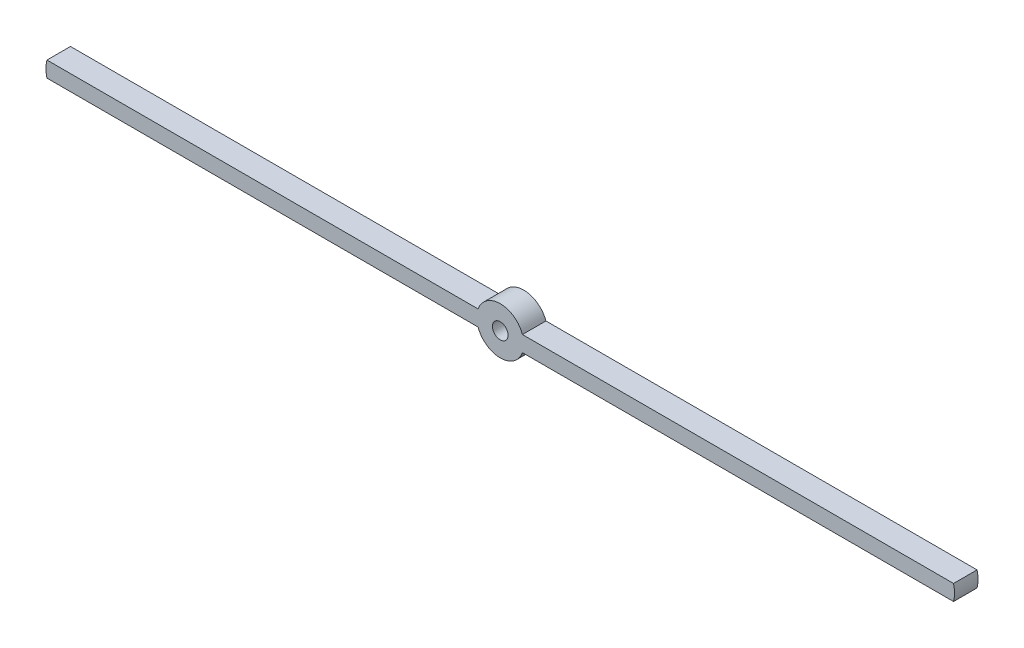
ISO-10303-21;
HEADER;
FILE_DESCRIPTION(('STEP AP214'),'2;1');
FILE_NAME('part.step','',(''),(''),'','','');
FILE_SCHEMA(('AUTOMOTIVE_DESIGN { 1 0 10303 214 1 1 1 1 }'));
ENDSEC;
DATA;
#1=APPLICATION_CONTEXT('core data for automotive mechanical design processes');
#2=APPLICATION_PROTOCOL_DEFINITION('international standard','automotive_design',2000,#1);
#3=PRODUCT_CONTEXT('',#1,'mechanical');
#4=PRODUCT('Part','Part','',(#3));
#5=PRODUCT_RELATED_PRODUCT_CATEGORY('part','',(#4));
#6=PRODUCT_DEFINITION_FORMATION('','',#4);
#7=PRODUCT_DEFINITION_CONTEXT('part definition',#1,'design');
#8=PRODUCT_DEFINITION('design','',#6,#7);
#9=PRODUCT_DEFINITION_SHAPE('','',#8);
#10=(LENGTH_UNIT() NAMED_UNIT(*) SI_UNIT(.MILLI.,.METRE.));
#11=(NAMED_UNIT(*) PLANE_ANGLE_UNIT() SI_UNIT($,.RADIAN.));
#12=(NAMED_UNIT(*) SI_UNIT($,.STERADIAN.) SOLID_ANGLE_UNIT());
#13=UNCERTAINTY_MEASURE_WITH_UNIT(LENGTH_MEASURE(1.E-05),#10,'distance_accuracy_value','');
#14=(GEOMETRIC_REPRESENTATION_CONTEXT(3) GLOBAL_UNCERTAINTY_ASSIGNED_CONTEXT((#13)) GLOBAL_UNIT_ASSIGNED_CONTEXT((#10,
#11,#12)) REPRESENTATION_CONTEXT('',''));
#15=CARTESIAN_POINT('',(0.,0.,0.));
#16=DIRECTION('',(0.,0.,1.));
#17=DIRECTION('',(1.,0.,0.));
#18=AXIS2_PLACEMENT_3D('',#15,#16,#17);
#19=CARTESIAN_POINT('',(0.,0.,6.));
#20=DIRECTION('',(0.,0.,-1.));
#21=DIRECTION('',(-1.,0.,0.));
#22=AXIS2_PLACEMENT_3D('',#19,#20,#21);
#23=PLANE('',#22);
#24=CARTESIAN_POINT('',(0.,0.,6.));
#25=DIRECTION('',(0.,0.,-1.));
#26=DIRECTION('',(-1.,0.,0.));
#27=AXIS2_PLACEMENT_3D('',#24,#25,#26);
#28=CIRCLE('',#27,6.);
#29=CARTESIAN_POINT('',(5.65685424949238,-2.,6.));
#30=VERTEX_POINT('',#29);
#31=CARTESIAN_POINT('',(-5.65685424949238,-2.,6.));
#32=VERTEX_POINT('',#31);
#33=EDGE_CURVE('E199',#30,#32,#28,.T.);
#34=ORIENTED_EDGE('',*,*,#33,.F.);
#35=DIRECTION('',(1.,0.,0.));
#36=VECTOR('',#35,1.);
#37=CARTESIAN_POINT('',(5.65685424949238,-2.,6.));
#38=LINE('',#37,#36);
#39=CARTESIAN_POINT('',(115.656854249492,-2.,6.));
#40=VERTEX_POINT('',#39);
#41=EDGE_CURVE('E157',#30,#40,#38,.T.);
#42=ORIENTED_EDGE('',*,*,#41,.T.);
#43=CARTESIAN_POINT('',(107.910887557078,0.,6.));
#44=DIRECTION('',(0.,0.,-1.));
#45=DIRECTION('',(-1.,0.,0.));
#46=AXIS2_PLACEMENT_3D('',#43,#44,#45);
#47=CIRCLE('',#46,8.00000000000001);
#48=CARTESIAN_POINT('',(115.656854249492,2.,6.));
#49=VERTEX_POINT('',#48);
#50=EDGE_CURVE('E140',#49,#40,#47,.T.);
#51=ORIENTED_EDGE('',*,*,#50,.F.);
#52=DIRECTION('',(1.,0.,0.));
#53=VECTOR('',#52,1.);
#54=CARTESIAN_POINT('',(5.65685424949238,2.,6.));
#55=LINE('',#54,#53);
#56=CARTESIAN_POINT('',(5.65685424949238,2.,6.));
#57=VERTEX_POINT('',#56);
#58=EDGE_CURVE('E155',#57,#49,#55,.T.);
#59=ORIENTED_EDGE('',*,*,#58,.F.);
#60=CARTESIAN_POINT('',(0.,-1.27068494615301E-13,6.));
#61=DIRECTION('',(0.,0.,-1.));
#62=DIRECTION('',(-1.,0.,0.));
#63=AXIS2_PLACEMENT_3D('',#60,#61,#62);
#64=CIRCLE('',#63,6.00000000000004);
#65=CARTESIAN_POINT('',(-5.65685424949238,2.,6.));
#66=VERTEX_POINT('',#65);
#67=EDGE_CURVE('E162',#66,#57,#64,.T.);
#68=ORIENTED_EDGE('',*,*,#67,.F.);
#69=DIRECTION('',(-1.,0.,0.));
#70=VECTOR('',#69,1.);
#71=CARTESIAN_POINT('',(-5.65685424949238,2.,6.));
#72=LINE('',#71,#70);
#73=CARTESIAN_POINT('',(-115.656854249492,2.00000000000002,6.));
#74=VERTEX_POINT('',#73);
#75=EDGE_CURVE('E166',#66,#74,#72,.T.);
#76=ORIENTED_EDGE('',*,*,#75,.T.);
#77=CARTESIAN_POINT('',(-107.910887557078,0.,6.));
#78=DIRECTION('',(0.,0.,1.));
#79=DIRECTION('',(1.,0.,0.));
#80=AXIS2_PLACEMENT_3D('',#77,#78,#79);
#81=CIRCLE('',#80,8.);
#82=CARTESIAN_POINT('',(-115.656854249492,-2.00000000000001,6.));
#83=VERTEX_POINT('',#82);
#84=EDGE_CURVE('E228',#74,#83,#81,.T.);
#85=ORIENTED_EDGE('',*,*,#84,.T.);
#86=DIRECTION('',(-1.,0.,0.));
#87=VECTOR('',#86,1.);
#88=CARTESIAN_POINT('',(-5.65685424949238,-2.,6.));
#89=LINE('',#88,#87);
#90=EDGE_CURVE('E223',#32,#83,#89,.T.);
#91=ORIENTED_EDGE('',*,*,#90,.F.);
#92=EDGE_LOOP('',(#34,#42,#51,#59,#68,#76,#85,#91));
#93=FACE_BOUND('',#92,.T.);
#94=CARTESIAN_POINT('',(0.,0.,6.));
#95=DIRECTION('',(0.,0.,1.));
#96=DIRECTION('',(1.,0.,0.));
#97=AXIS2_PLACEMENT_3D('',#94,#95,#96);
#98=CIRCLE('',#97,2.);
#99=CARTESIAN_POINT('',(2.,0.,6.));
#100=VERTEX_POINT('',#99);
#101=EDGE_CURVE('E177',#100,#100,#98,.T.);
#102=ORIENTED_EDGE('',*,*,#101,.F.);
#103=EDGE_LOOP('',(#102));
#104=FACE_BOUND('',#103,.T.);
#105=ADVANCED_FACE('F66',(#93,#104),#23,.F.);
#106=CARTESIAN_POINT('',(0.,0.,0.));
#107=DIRECTION('',(0.,0.,-1.));
#108=DIRECTION('',(-1.,0.,0.));
#109=AXIS2_PLACEMENT_3D('',#106,#107,#108);
#110=PLANE('',#109);
#111=CARTESIAN_POINT('',(0.,0.,0.));
#112=DIRECTION('',(0.,0.,-1.));
#113=DIRECTION('',(-1.,0.,0.));
#114=AXIS2_PLACEMENT_3D('',#111,#112,#113);
#115=CIRCLE('',#114,6.);
#116=CARTESIAN_POINT('',(5.65685424949238,-2.,0.));
#117=VERTEX_POINT('',#116);
#118=CARTESIAN_POINT('',(-5.65685424949238,-2.,0.));
#119=VERTEX_POINT('',#118);
#120=EDGE_CURVE('E172',#117,#119,#115,.T.);
#121=ORIENTED_EDGE('',*,*,#120,.T.);
#122=DIRECTION('',(-1.,0.,0.));
#123=VECTOR('',#122,1.);
#124=CARTESIAN_POINT('',(-5.65685424949238,-2.,0.));
#125=LINE('',#124,#123);
#126=CARTESIAN_POINT('',(-115.656854249492,-2.00000000000001,0.));
#127=VERTEX_POINT('',#126);
#128=EDGE_CURVE('E176',#119,#127,#125,.T.);
#129=ORIENTED_EDGE('',*,*,#128,.T.);
#130=CARTESIAN_POINT('',(-107.910887557078,0.,0.));
#131=DIRECTION('',(0.,0.,1.));
#132=DIRECTION('',(1.,0.,0.));
#133=AXIS2_PLACEMENT_3D('',#130,#131,#132);
#134=CIRCLE('',#133,8.);
#135=CARTESIAN_POINT('',(-115.656854249492,2.00000000000002,0.));
#136=VERTEX_POINT('',#135);
#137=EDGE_CURVE('E181',#136,#127,#134,.T.);
#138=ORIENTED_EDGE('',*,*,#137,.F.);
#139=DIRECTION('',(-1.,0.,0.));
#140=VECTOR('',#139,1.);
#141=CARTESIAN_POINT('',(-5.65685424949238,2.,0.));
#142=LINE('',#141,#140);
#143=CARTESIAN_POINT('',(-5.65685424949238,2.,0.));
#144=VERTEX_POINT('',#143);
#145=EDGE_CURVE('E185',#144,#136,#142,.T.);
#146=ORIENTED_EDGE('',*,*,#145,.F.);
#147=CARTESIAN_POINT('',(0.,-1.27068494615301E-13,0.));
#148=DIRECTION('',(0.,0.,-1.));
#149=DIRECTION('',(-1.,0.,0.));
#150=AXIS2_PLACEMENT_3D('',#147,#148,#149);
#151=CIRCLE('',#150,6.00000000000004);
#152=CARTESIAN_POINT('',(5.65685424949238,2.,0.));
#153=VERTEX_POINT('',#152);
#154=EDGE_CURVE('E188',#144,#153,#151,.T.);
#155=ORIENTED_EDGE('',*,*,#154,.T.);
#156=DIRECTION('',(1.,0.,0.));
#157=VECTOR('',#156,1.);
#158=CARTESIAN_POINT('',(5.65685424949238,2.,0.));
#159=LINE('',#158,#157);
#160=CARTESIAN_POINT('',(115.656854249492,2.,0.));
#161=VERTEX_POINT('',#160);
#162=EDGE_CURVE('E192',#153,#161,#159,.T.);
#163=ORIENTED_EDGE('',*,*,#162,.T.);
#164=CARTESIAN_POINT('',(107.910887557078,0.,0.));
#165=DIRECTION('',(0.,0.,-1.));
#166=DIRECTION('',(-1.,0.,0.));
#167=AXIS2_PLACEMENT_3D('',#164,#165,#166);
#168=CIRCLE('',#167,8.00000000000001);
#169=CARTESIAN_POINT('',(115.656854249492,-2.,0.));
#170=VERTEX_POINT('',#169);
#171=EDGE_CURVE('E142',#161,#170,#168,.T.);
#172=ORIENTED_EDGE('',*,*,#171,.T.);
#173=DIRECTION('',(1.,0.,0.));
#174=VECTOR('',#173,1.);
#175=CARTESIAN_POINT('',(5.65685424949238,-2.,0.));
#176=LINE('',#175,#174);
#177=EDGE_CURVE('E197',#117,#170,#176,.T.);
#178=ORIENTED_EDGE('',*,*,#177,.F.);
#179=EDGE_LOOP('',(#121,#129,#138,#146,#155,#163,#172,#178));
#180=FACE_BOUND('',#179,.T.);
#181=CARTESIAN_POINT('',(0.,0.,0.));
#182=DIRECTION('',(0.,0.,1.));
#183=DIRECTION('',(1.,0.,0.));
#184=AXIS2_PLACEMENT_3D('',#181,#182,#183);
#185=CIRCLE('',#184,2.);
#186=CARTESIAN_POINT('',(2.,0.,0.));
#187=VERTEX_POINT('',#186);
#188=EDGE_CURVE('E231',#187,#187,#185,.T.);
#189=ORIENTED_EDGE('',*,*,#188,.T.);
#190=EDGE_LOOP('',(#189));
#191=FACE_BOUND('',#190,.T.);
#192=ADVANCED_FACE('F220',(#180,#191),#110,.T.);
#193=CARTESIAN_POINT('',(0.,0.,6.));
#194=DIRECTION('',(0.,0.,-1.));
#195=DIRECTION('',(-1.,0.,0.));
#196=AXIS2_PLACEMENT_3D('',#193,#194,#195);
#197=CYLINDRICAL_SURFACE('',#196,6.);
#198=ORIENTED_EDGE('',*,*,#120,.F.);
#199=DIRECTION('',(0.,0.,-1.));
#200=VECTOR('',#199,1.);
#201=CARTESIAN_POINT('',(5.65685424949238,-2.,6.));
#202=LINE('',#201,#200);
#203=EDGE_CURVE('E12',#30,#117,#202,.T.);
#204=ORIENTED_EDGE('',*,*,#203,.F.);
#205=ORIENTED_EDGE('',*,*,#33,.T.);
#206=DIRECTION('',(0.,0.,-1.));
#207=VECTOR('',#206,1.);
#208=CARTESIAN_POINT('',(-5.65685424949238,-2.,6.));
#209=LINE('',#208,#207);
#210=EDGE_CURVE('E70',#32,#119,#209,.T.);
#211=ORIENTED_EDGE('',*,*,#210,.T.);
#212=EDGE_LOOP('',(#198,#204,#205,#211));
#213=FACE_BOUND('',#212,.T.);
#214=ADVANCED_FACE('F68',(#213),#197,.T.);
#215=CARTESIAN_POINT('',(5.65685424949238,-2.,6.));
#216=DIRECTION('',(0.,1.,0.));
#217=DIRECTION('',(0.,0.,1.));
#218=AXIS2_PLACEMENT_3D('',#215,#216,#217);
#219=PLANE('',#218);
#220=ORIENTED_EDGE('',*,*,#177,.T.);
#221=DIRECTION('',(0.,0.,-1.));
#222=VECTOR('',#221,1.);
#223=CARTESIAN_POINT('',(115.656854249492,-2.,6.));
#224=LINE('',#223,#222);
#225=EDGE_CURVE('E77',#40,#170,#224,.T.);
#226=ORIENTED_EDGE('',*,*,#225,.F.);
#227=ORIENTED_EDGE('',*,*,#41,.F.);
#228=ORIENTED_EDGE('',*,*,#203,.T.);
#229=EDGE_LOOP('',(#220,#226,#227,#228));
#230=FACE_BOUND('',#229,.T.);
#231=ADVANCED_FACE('F222',(#230),#219,.F.);
#232=CARTESIAN_POINT('',(107.910887557078,0.,6.));
#233=DIRECTION('',(0.,0.,-1.));
#234=DIRECTION('',(-1.,0.,0.));
#235=AXIS2_PLACEMENT_3D('',#232,#233,#234);
#236=CYLINDRICAL_SURFACE('',#235,8.00000000000001);
#237=ORIENTED_EDGE('',*,*,#171,.F.);
#238=DIRECTION('',(0.,0.,-1.));
#239=VECTOR('',#238,1.);
#240=CARTESIAN_POINT('',(115.656854249492,2.,6.));
#241=LINE('',#240,#239);
#242=EDGE_CURVE('E137',#49,#161,#241,.T.);
#243=ORIENTED_EDGE('',*,*,#242,.F.);
#244=ORIENTED_EDGE('',*,*,#50,.T.);
#245=ORIENTED_EDGE('',*,*,#225,.T.);
#246=EDGE_LOOP('',(#237,#243,#244,#245));
#247=FACE_BOUND('',#246,.T.);
#248=ADVANCED_FACE('F139',(#247),#236,.T.);
#249=CARTESIAN_POINT('',(5.65685424949238,2.,6.));
#250=DIRECTION('',(0.,1.,0.));
#251=DIRECTION('',(0.,0.,1.));
#252=AXIS2_PLACEMENT_3D('',#249,#250,#251);
#253=PLANE('',#252);
#254=ORIENTED_EDGE('',*,*,#162,.F.);
#255=DIRECTION('',(0.,0.,-1.));
#256=VECTOR('',#255,1.);
#257=CARTESIAN_POINT('',(5.65685424949238,2.,6.));
#258=LINE('',#257,#256);
#259=EDGE_CURVE('E148',#57,#153,#258,.T.);
#260=ORIENTED_EDGE('',*,*,#259,.F.);
#261=ORIENTED_EDGE('',*,*,#58,.T.);
#262=ORIENTED_EDGE('',*,*,#242,.T.);
#263=EDGE_LOOP('',(#254,#260,#261,#262));
#264=FACE_BOUND('',#263,.T.);
#265=ADVANCED_FACE('F160',(#264),#253,.T.);
#266=CARTESIAN_POINT('',(0.,-1.27068494615301E-13,6.));
#267=DIRECTION('',(0.,0.,-1.));
#268=DIRECTION('',(-1.,0.,0.));
#269=AXIS2_PLACEMENT_3D('',#266,#267,#268);
#270=CYLINDRICAL_SURFACE('',#269,6.00000000000004);
#271=ORIENTED_EDGE('',*,*,#154,.F.);
#272=DIRECTION('',(0.,0.,-1.));
#273=VECTOR('',#272,1.);
#274=CARTESIAN_POINT('',(-5.65685424949238,2.,6.));
#275=LINE('',#274,#273);
#276=EDGE_CURVE('E205',#66,#144,#275,.T.);
#277=ORIENTED_EDGE('',*,*,#276,.F.);
#278=ORIENTED_EDGE('',*,*,#67,.T.);
#279=ORIENTED_EDGE('',*,*,#259,.T.);
#280=EDGE_LOOP('',(#271,#277,#278,#279));
#281=FACE_BOUND('',#280,.T.);
#282=ADVANCED_FACE('F247',(#281),#270,.T.);
#283=CARTESIAN_POINT('',(-5.65685424949238,2.,6.));
#284=DIRECTION('',(0.,-1.,0.));
#285=DIRECTION('',(1.,0.,0.));
#286=AXIS2_PLACEMENT_3D('',#283,#284,#285);
#287=PLANE('',#286);
#288=ORIENTED_EDGE('',*,*,#145,.T.);
#289=DIRECTION('',(0.,0.,-1.));
#290=VECTOR('',#289,1.);
#291=CARTESIAN_POINT('',(-115.656854249492,2.00000000000002,6.));
#292=LINE('',#291,#290);
#293=EDGE_CURVE('E208',#74,#136,#292,.T.);
#294=ORIENTED_EDGE('',*,*,#293,.F.);
#295=ORIENTED_EDGE('',*,*,#75,.F.);
#296=ORIENTED_EDGE('',*,*,#276,.T.);
#297=EDGE_LOOP('',(#288,#294,#295,#296));
#298=FACE_BOUND('',#297,.T.);
#299=ADVANCED_FACE('F241',(#298),#287,.F.);
#300=CARTESIAN_POINT('',(-107.910887557078,0.,6.));
#301=DIRECTION('',(0.,0.,-1.));
#302=DIRECTION('',(-1.,0.,0.));
#303=AXIS2_PLACEMENT_3D('',#300,#301,#302);
#304=CYLINDRICAL_SURFACE('',#303,8.);
#305=ORIENTED_EDGE('',*,*,#137,.T.);
#306=DIRECTION('',(0.,0.,-1.));
#307=VECTOR('',#306,1.);
#308=CARTESIAN_POINT('',(-115.656854249492,-2.00000000000001,6.));
#309=LINE('',#308,#307);
#310=EDGE_CURVE('E211',#83,#127,#309,.T.);
#311=ORIENTED_EDGE('',*,*,#310,.F.);
#312=ORIENTED_EDGE('',*,*,#84,.F.);
#313=ORIENTED_EDGE('',*,*,#293,.T.);
#314=EDGE_LOOP('',(#305,#311,#312,#313));
#315=FACE_BOUND('',#314,.T.);
#316=ADVANCED_FACE('F244',(#315),#304,.T.);
#317=CARTESIAN_POINT('',(-5.65685424949238,-2.,6.));
#318=DIRECTION('',(0.,-1.,0.));
#319=DIRECTION('',(1.,0.,0.));
#320=AXIS2_PLACEMENT_3D('',#317,#318,#319);
#321=PLANE('',#320);
#322=ORIENTED_EDGE('',*,*,#128,.F.);
#323=ORIENTED_EDGE('',*,*,#210,.F.);
#324=ORIENTED_EDGE('',*,*,#90,.T.);
#325=ORIENTED_EDGE('',*,*,#310,.T.);
#326=EDGE_LOOP('',(#322,#323,#324,#325));
#327=FACE_BOUND('',#326,.T.);
#328=ADVANCED_FACE('F217',(#327),#321,.T.);
#329=CARTESIAN_POINT('',(0.,0.,6.));
#330=DIRECTION('',(0.,0.,-1.));
#331=DIRECTION('',(-1.,0.,0.));
#332=AXIS2_PLACEMENT_3D('',#329,#330,#331);
#333=CYLINDRICAL_SURFACE('',#332,2.);
#334=ORIENTED_EDGE('',*,*,#101,.T.);
#335=EDGE_LOOP('',(#334));
#336=FACE_BOUND('',#335,.T.);
#337=ORIENTED_EDGE('',*,*,#188,.F.);
#338=EDGE_LOOP('',(#337));
#339=FACE_BOUND('',#338,.T.);
#340=ADVANCED_FACE('F263',(#336,#339),#333,.F.);
#341=CLOSED_SHELL('',(#105,#192,#214,#231,#248,#265,#282,#299,#316,#328,#340));
#342=MANIFOLD_SOLID_BREP('B2',#341);
#343=ADVANCED_BREP_SHAPE_REPRESENTATION('',(#18,#342),#14);
#344=SHAPE_DEFINITION_REPRESENTATION(#9,#343);
ENDSEC;
END-ISO-10303-21;
